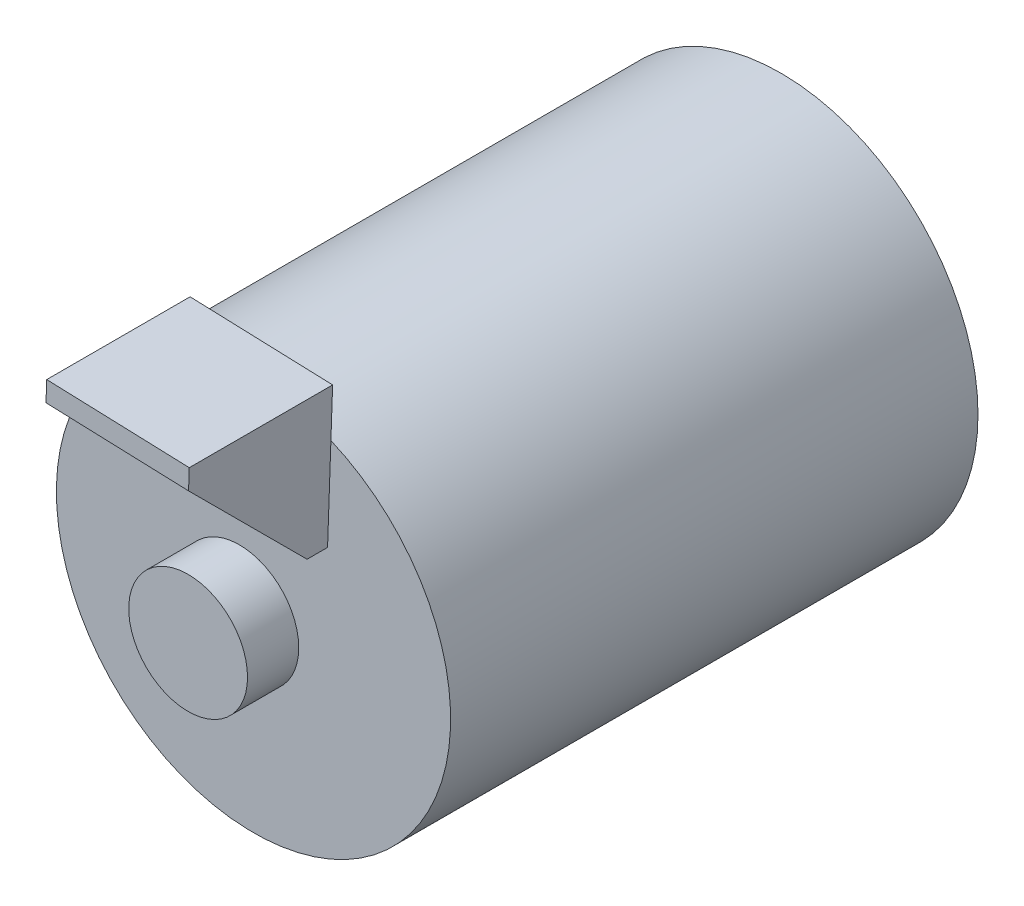
ISO-10303-21;
HEADER;
FILE_DESCRIPTION(('STEP AP214'),'2;1');
FILE_NAME('part.step','',(''),(''),'','','');
FILE_SCHEMA(('AUTOMOTIVE_DESIGN { 1 0 10303 214 1 1 1 1 }'));
ENDSEC;
DATA;
#1=APPLICATION_CONTEXT('core data for automotive mechanical design processes');
#2=APPLICATION_PROTOCOL_DEFINITION('international standard','automotive_design',2000,#1);
#3=PRODUCT_CONTEXT('',#1,'mechanical');
#4=PRODUCT('Part','Part','',(#3));
#5=PRODUCT_RELATED_PRODUCT_CATEGORY('part','',(#4));
#6=PRODUCT_DEFINITION_FORMATION('','',#4);
#7=PRODUCT_DEFINITION_CONTEXT('part definition',#1,'design');
#8=PRODUCT_DEFINITION('design','',#6,#7);
#9=PRODUCT_DEFINITION_SHAPE('','',#8);
#10=(LENGTH_UNIT() NAMED_UNIT(*) SI_UNIT(.MILLI.,.METRE.));
#11=(NAMED_UNIT(*) PLANE_ANGLE_UNIT() SI_UNIT($,.RADIAN.));
#12=(NAMED_UNIT(*) SI_UNIT($,.STERADIAN.) SOLID_ANGLE_UNIT());
#13=UNCERTAINTY_MEASURE_WITH_UNIT(LENGTH_MEASURE(1.E-05),#10,'distance_accuracy_value','');
#14=(GEOMETRIC_REPRESENTATION_CONTEXT(3) GLOBAL_UNCERTAINTY_ASSIGNED_CONTEXT((#13)) GLOBAL_UNIT_ASSIGNED_CONTEXT((#10,
#11,#12)) REPRESENTATION_CONTEXT('',''));
#15=CARTESIAN_POINT('',(0.,0.,0.));
#16=DIRECTION('',(0.,0.,1.));
#17=DIRECTION('',(1.,0.,0.));
#18=AXIS2_PLACEMENT_3D('',#15,#16,#17);
#19=CARTESIAN_POINT('',(14.6085511390068,16.9953003391827,107.));
#20=DIRECTION('',(-0.0249411804596424,-0.70666677968989,0.707106781186548));
#21=DIRECTION('',(0.,-0.707326816148419,-0.706886677733667));
#22=AXIS2_PLACEMENT_3D('',#19,#20,#21);
#23=PLANE('',#22);
#24=DIRECTION('',(-0.999377743915962,0.0352721556676211,0.));
#25=VECTOR('',#24,1.);
#26=CARTESIAN_POINT('',(0.758351346853853,21.4866214941932,111.));
#27=LINE('',#26,#25);
#28=CARTESIAN_POINT('',(10.6097199732771,21.1389261309077,111.));
#29=VERTEX_POINT('',#28);
#30=CARTESIAN_POINT('',(-9.23542609230577,21.8393430508694,111.));
#31=VERTEX_POINT('',#30);
#32=EDGE_CURVE('E146',#29,#31,#27,.T.);
#33=ORIENTED_EDGE('',*,*,#32,.T.);
#34=DIRECTION('',(0.0249411804596424,0.70666677968989,0.707106781186547));
#35=VECTOR('',#34,1.);
#36=CARTESIAN_POINT('',(-9.37651471497625,17.8418320752056,107.));
#37=LINE('',#36,#35);
#38=CARTESIAN_POINT('',(-8.52998297895335,41.8268979291887,131.));
#39=VERTEX_POINT('',#38);
#40=EDGE_CURVE('E219',#31,#39,#37,.T.);
#41=ORIENTED_EDGE('',*,*,#40,.T.);
#42=DIRECTION('',(0.999377743915963,-0.0352721556676211,0.));
#43=VECTOR('',#42,1.);
#44=CARTESIAN_POINT('',(1.46379446020627,41.4741763725125,131.));
#45=LINE('',#44,#43);
#46=CARTESIAN_POINT('',(-12.5274939546172,41.9679865518592,131.));
#47=VERTEX_POINT('',#46);
#48=EDGE_CURVE('E54',#47,#39,#45,.T.);
#49=ORIENTED_EDGE('',*,*,#48,.F.);
#50=DIRECTION('',(0.0249411804596424,0.70666677968989,0.707106781186547));
#51=VECTOR('',#50,1.);
#52=CARTESIAN_POINT('',(-13.3740256906401,17.982920697876,107.));
#53=LINE('',#52,#51);
#54=CARTESIAN_POINT('',(-13.3740256906401,17.982920697876,107.));
#55=VERTEX_POINT('',#54);
#56=EDGE_CURVE('E218',#55,#47,#53,.T.);
#57=ORIENTED_EDGE('',*,*,#56,.F.);
#58=DIRECTION('',(-0.999377743915962,0.0352721556676211,0.));
#59=VECTOR('',#58,1.);
#60=CARTESIAN_POINT('',(14.6085511390068,16.9953003391827,107.));
#61=LINE('',#60,#59);
#62=CARTESIAN_POINT('',(14.4661423262705,17.0003265325734,107.));
#63=VERTEX_POINT('',#62);
#64=EDGE_CURVE('E232',#63,#55,#61,.T.);
#65=ORIENTED_EDGE('',*,*,#64,.F.);
#66=DIRECTION('',(-0.0249411804596425,-0.70666677968989,-0.707106781186547));
#67=VECTOR('',#66,1.);
#68=CARTESIAN_POINT('',(14.5807768321902,20.2483042003002,110.25));
#69=LINE('',#68,#67);
#70=CARTESIAN_POINT('',(15.3126740622934,40.9853923865565,131.));
#71=VERTEX_POINT('',#70);
#72=EDGE_CURVE('E236',#71,#63,#69,.T.);
#73=ORIENTED_EDGE('',*,*,#72,.F.);
#74=CARTESIAN_POINT('',(11.3151630866295,41.1264810092269,131.));
#75=VERTEX_POINT('',#74);
#76=EDGE_CURVE('E69',#75,#71,#45,.T.);
#77=ORIENTED_EDGE('',*,*,#76,.F.);
#78=DIRECTION('',(-0.0249411804596425,-0.70666677968989,-0.707106781186547));
#79=VECTOR('',#78,1.);
#80=CARTESIAN_POINT('',(10.5832658565264,20.3893928229707,110.25));
#81=LINE('',#80,#79);
#82=EDGE_CURVE('E226',#75,#29,#81,.T.);
#83=ORIENTED_EDGE('',*,*,#82,.T.);
#84=EDGE_LOOP('',(#33,#41,#49,#57,#65,#73,#77,#83));
#85=FACE_BOUND('',#84,.T.);
#86=ADVANCED_FACE('F45',(#85),#23,.T.);
#87=CARTESIAN_POINT('',(13.8488796020871,-0.488783985956003,131.));
#88=DIRECTION('',(0.999377743915962,-0.0352721556676213,0.));
#89=DIRECTION('',(0.0352721556676213,0.999377743915963,0.));
#90=AXIS2_PLACEMENT_3D('',#87,#88,#89);
#91=PLANE('',#90);
#92=DIRECTION('',(-0.0352721556676213,-0.999377743915963,0.));
#93=VECTOR('',#92,1.);
#94=CARTESIAN_POINT('',(13.8488796020871,-0.488783985956003,131.));
#95=LINE('',#94,#93);
#96=CARTESIAN_POINT('',(15.4537626849639,44.9829033622203,131.));
#97=VERTEX_POINT('',#96);
#98=EDGE_CURVE('E241',#97,#71,#95,.T.);
#99=ORIENTED_EDGE('',*,*,#98,.T.);
#100=ORIENTED_EDGE('',*,*,#72,.T.);
#101=DIRECTION('',(0.,0.,-1.));
#102=VECTOR('',#101,1.);
#103=CARTESIAN_POINT('',(14.4661423262705,17.0003265325733,131.));
#104=LINE('',#103,#102);
#105=CARTESIAN_POINT('',(14.4661423262705,17.0003265325733,103.));
#106=VERTEX_POINT('',#105);
#107=EDGE_CURVE('E253',#63,#106,#104,.T.);
#108=ORIENTED_EDGE('',*,*,#107,.T.);
#109=DIRECTION('',(0.0352721556676213,0.999377743915963,0.));
#110=VECTOR('',#109,1.);
#111=CARTESIAN_POINT('',(13.8488796020871,-0.488783985956003,103.));
#112=LINE('',#111,#110);
#113=CARTESIAN_POINT('',(15.1158422870537,35.4084920880983,103.));
#114=VERTEX_POINT('',#113);
#115=EDGE_CURVE('E307',#106,#114,#112,.T.);
#116=ORIENTED_EDGE('',*,*,#115,.T.);
#117=DIRECTION('',(-0.0352721556676213,-0.999377743915963,0.));
#118=VECTOR('',#117,1.);
#119=CARTESIAN_POINT('',(13.8488796020871,-0.488783985956003,103.));
#120=LINE('',#119,#118);
#121=CARTESIAN_POINT('',(15.4537626849639,44.9829033622203,103.));
#122=VERTEX_POINT('',#121);
#123=EDGE_CURVE('E240',#122,#114,#120,.T.);
#124=ORIENTED_EDGE('',*,*,#123,.F.);
#125=DIRECTION('',(0.,0.,-1.));
#126=VECTOR('',#125,1.);
#127=CARTESIAN_POINT('',(15.4537626849639,44.9829033622203,131.));
#128=LINE('',#127,#126);
#129=EDGE_CURVE('E276',#97,#122,#128,.T.);
#130=ORIENTED_EDGE('',*,*,#129,.F.);
#131=EDGE_LOOP('',(#99,#100,#108,#116,#124,#130));
#132=FACE_BOUND('',#131,.T.);
#133=ADVANCED_FACE('F363',(#132),#91,.T.);
#134=CARTESIAN_POINT('',(-13.9912884148235,0.493810179346694,131.));
#135=DIRECTION('',(0.999377743915962,-0.035272155667621,0.));
#136=DIRECTION('',(0.035272155667621,0.999377743915963,0.));
#137=AXIS2_PLACEMENT_3D('',#134,#135,#136);
#138=PLANE('',#137);
#139=ORIENTED_EDGE('',*,*,#56,.T.);
#140=DIRECTION('',(-0.035272155667621,-0.999377743915963,0.));
#141=VECTOR('',#140,1.);
#142=CARTESIAN_POINT('',(-13.9912884148235,0.493810179346694,131.));
#143=LINE('',#142,#141);
#144=CARTESIAN_POINT('',(-12.3864053319467,45.965497527523,131.));
#145=VERTEX_POINT('',#144);
#146=EDGE_CURVE('E249',#145,#47,#143,.T.);
#147=ORIENTED_EDGE('',*,*,#146,.F.);
#148=DIRECTION('',(0.,0.,-1.));
#149=VECTOR('',#148,1.);
#150=CARTESIAN_POINT('',(-12.3864053319467,45.965497527523,131.));
#151=LINE('',#150,#149);
#152=CARTESIAN_POINT('',(-12.3864053319467,45.965497527523,103.));
#153=VERTEX_POINT('',#152);
#154=EDGE_CURVE('E272',#145,#153,#151,.T.);
#155=ORIENTED_EDGE('',*,*,#154,.T.);
#156=DIRECTION('',(-0.035272155667621,-0.999377743915963,0.));
#157=VECTOR('',#156,1.);
#158=CARTESIAN_POINT('',(-13.9912884148235,0.493810179346694,103.));
#159=LINE('',#158,#157);
#160=CARTESIAN_POINT('',(-12.7262762659497,36.335821064106,103.));
#161=VERTEX_POINT('',#160);
#162=EDGE_CURVE('E260',#153,#161,#159,.T.);
#163=ORIENTED_EDGE('',*,*,#162,.T.);
#164=DIRECTION('',(0.035272155667621,0.999377743915963,0.));
#165=VECTOR('',#164,1.);
#166=CARTESIAN_POINT('',(-13.9912884148235,0.493810179346695,103.));
#167=LINE('',#166,#165);
#168=CARTESIAN_POINT('',(-13.3740256906401,17.982920697876,103.));
#169=VERTEX_POINT('',#168);
#170=EDGE_CURVE('E296',#169,#161,#167,.T.);
#171=ORIENTED_EDGE('',*,*,#170,.F.);
#172=DIRECTION('',(0.,0.,-1.));
#173=VECTOR('',#172,1.);
#174=CARTESIAN_POINT('',(-13.3740256906401,17.982920697876,131.));
#175=LINE('',#174,#173);
#176=EDGE_CURVE('E269',#55,#169,#175,.T.);
#177=ORIENTED_EDGE('',*,*,#176,.F.);
#178=EDGE_LOOP('',(#139,#147,#155,#163,#171,#177));
#179=FACE_BOUND('',#178,.T.);
#180=ADVANCED_FACE('F369',(#179),#138,.F.);
#181=CARTESIAN_POINT('',(0.617262724183369,17.4891105185294,131.));
#182=DIRECTION('',(-0.0352721556676211,-0.999377743915962,0.));
#183=DIRECTION('',(0.999377743915963,-0.0352721556676211,0.));
#184=AXIS2_PLACEMENT_3D('',#181,#182,#183);
#185=PLANE('',#184);
#186=ORIENTED_EDGE('',*,*,#107,.F.);
#187=ORIENTED_EDGE('',*,*,#64,.T.);
#188=ORIENTED_EDGE('',*,*,#176,.T.);
#189=DIRECTION('',(-0.999377743915963,0.0352721556676211,0.));
#190=VECTOR('',#189,1.);
#191=CARTESIAN_POINT('',(0.617262724183369,17.4891105185294,103.));
#192=LINE('',#191,#190);
#193=EDGE_CURVE('E246',#106,#169,#192,.T.);
#194=ORIENTED_EDGE('',*,*,#193,.F.);
#195=EDGE_LOOP('',(#186,#187,#188,#194));
#196=FACE_BOUND('',#195,.T.);
#197=ADVANCED_FACE('F359',(#196),#185,.T.);
#198=CARTESIAN_POINT('',(0.,0.,131.));
#199=DIRECTION('',(0.,0.,1.));
#200=DIRECTION('',(1.,0.,0.));
#201=AXIS2_PLACEMENT_3D('',#198,#199,#200);
#202=PLANE('',#201);
#203=ORIENTED_EDGE('',*,*,#146,.T.);
#204=ORIENTED_EDGE('',*,*,#48,.T.);
#205=DIRECTION('',(0.999377743915963,-0.0352721556676211,0.));
#206=VECTOR('',#205,1.);
#207=CARTESIAN_POINT('',(1.46379446020627,41.4741763725125,131.));
#208=LINE('',#207,#206);
#209=EDGE_CURVE('E160',#39,#75,#208,.T.);
#210=ORIENTED_EDGE('',*,*,#209,.T.);
#211=ORIENTED_EDGE('',*,*,#76,.T.);
#212=ORIENTED_EDGE('',*,*,#98,.F.);
#213=DIRECTION('',(-0.999377743915963,0.0352721556676212,0.));
#214=VECTOR('',#213,1.);
#215=CARTESIAN_POINT('',(1.60488308287676,45.4716873481763,131.));
#216=LINE('',#215,#214);
#217=EDGE_CURVE('E245',#97,#145,#216,.T.);
#218=ORIENTED_EDGE('',*,*,#217,.T.);
#219=EDGE_LOOP('',(#203,#204,#210,#211,#212,#218));
#220=FACE_BOUND('',#219,.T.);
#221=ADVANCED_FACE('F350',(#220),#202,.T.);
#222=CARTESIAN_POINT('',(0.,0.,103.));
#223=DIRECTION('',(0.,0.,-1.));
#224=DIRECTION('',(-1.,0.,0.));
#225=AXIS2_PLACEMENT_3D('',#222,#223,#224);
#226=CYLINDRICAL_SURFACE('',#225,38.5);
#227=CARTESIAN_POINT('',(0.,0.,103.));
#228=DIRECTION('',(0.,0.,1.));
#229=DIRECTION('',(1.,0.,0.));
#230=AXIS2_PLACEMENT_3D('',#227,#228,#229);
#231=CIRCLE('',#230,38.5);
#232=EDGE_CURVE('E297',#114,#161,#231,.T.);
#233=ORIENTED_EDGE('',*,*,#232,.F.);
#234=EDGE_CURVE('E301',#161,#114,#231,.T.);
#235=ORIENTED_EDGE('',*,*,#234,.F.);
#236=EDGE_LOOP('',(#233,#235));
#237=FACE_BOUND('',#236,.T.);
#238=CARTESIAN_POINT('',(0.,0.,0.));
#239=DIRECTION('',(0.,0.,1.));
#240=DIRECTION('',(1.,0.,0.));
#241=AXIS2_PLACEMENT_3D('',#238,#239,#240);
#242=CIRCLE('',#241,38.5);
#243=CARTESIAN_POINT('',(38.5,0.,0.));
#244=VERTEX_POINT('',#243);
#245=EDGE_CURVE('E291',#244,#244,#242,.T.);
#246=ORIENTED_EDGE('',*,*,#245,.T.);
#247=EDGE_LOOP('',(#246));
#248=FACE_BOUND('',#247,.T.);
#249=ADVANCED_FACE('F47',(#237,#248),#226,.T.);
#250=CARTESIAN_POINT('',(0.,0.,103.));
#251=DIRECTION('',(0.,0.,1.));
#252=DIRECTION('',(1.,0.,0.));
#253=AXIS2_PLACEMENT_3D('',#250,#251,#252);
#254=PLANE('',#253);
#255=ORIENTED_EDGE('',*,*,#115,.F.);
#256=ORIENTED_EDGE('',*,*,#193,.T.);
#257=ORIENTED_EDGE('',*,*,#170,.T.);
#258=ORIENTED_EDGE('',*,*,#234,.T.);
#259=EDGE_LOOP('',(#255,#256,#257,#258));
#260=FACE_BOUND('',#259,.T.);
#261=CARTESIAN_POINT('',(0.,0.,103.));
#262=DIRECTION('',(0.,0.,1.));
#263=DIRECTION('',(1.,0.,0.));
#264=AXIS2_PLACEMENT_3D('',#261,#262,#263);
#265=CIRCLE('',#264,6.);
#266=CARTESIAN_POINT('',(6.,0.,103.));
#267=VERTEX_POINT('',#266);
#268=EDGE_CURVE('E292',#267,#267,#265,.T.);
#269=ORIENTED_EDGE('',*,*,#268,.F.);
#270=EDGE_LOOP('',(#269));
#271=FACE_BOUND('',#270,.T.);
#272=ADVANCED_FACE('F346',(#260,#271),#254,.T.);
#273=CARTESIAN_POINT('',(0.,0.,0.));
#274=DIRECTION('',(0.,0.,1.));
#275=DIRECTION('',(1.,0.,0.));
#276=AXIS2_PLACEMENT_3D('',#273,#274,#275);
#277=PLANE('',#276);
#278=CARTESIAN_POINT('',(0.,0.,0.));
#279=DIRECTION('',(0.,0.,1.));
#280=DIRECTION('',(1.,0.,0.));
#281=AXIS2_PLACEMENT_3D('',#278,#279,#280);
#282=CIRCLE('',#281,5.);
#283=CARTESIAN_POINT('',(5.,0.,0.));
#284=VERTEX_POINT('',#283);
#285=EDGE_CURVE('E11',#284,#284,#282,.F.);
#286=ORIENTED_EDGE('',*,*,#285,.F.);
#287=EDGE_LOOP('',(#286));
#288=FACE_BOUND('',#287,.T.);
#289=ORIENTED_EDGE('',*,*,#245,.F.);
#290=EDGE_LOOP('',(#289));
#291=FACE_BOUND('',#290,.T.);
#292=ADVANCED_FACE('F342',(#288,#291),#277,.F.);
#293=CARTESIAN_POINT('',(0.,0.,115.76716629368));
#294=DIRECTION('',(0.,0.,1.));
#295=DIRECTION('',(1.,0.,0.));
#296=AXIS2_PLACEMENT_3D('',#293,#294,#295);
#297=CYLINDRICAL_SURFACE('',#296,6.);
#298=ORIENTED_EDGE('',*,*,#268,.T.);
#299=EDGE_LOOP('',(#298));
#300=FACE_BOUND('',#299,.T.);
#301=CARTESIAN_POINT('',(0.,0.,105.76716629368));
#302=DIRECTION('',(0.,0.,1.));
#303=DIRECTION('',(1.,0.,0.));
#304=AXIS2_PLACEMENT_3D('',#301,#302,#303);
#305=CIRCLE('',#304,6.);
#306=CARTESIAN_POINT('',(6.,0.,105.76716629368));
#307=VERTEX_POINT('',#306);
#308=EDGE_CURVE('E287',#307,#307,#305,.T.);
#309=ORIENTED_EDGE('',*,*,#308,.F.);
#310=EDGE_LOOP('',(#309));
#311=FACE_BOUND('',#310,.T.);
#312=ADVANCED_FACE('F345',(#300,#311),#297,.T.);
#313=CARTESIAN_POINT('',(0.,-6.,105.76716629368));
#314=DIRECTION('',(0.,0.,-1.));
#315=DIRECTION('',(-1.,0.,0.));
#316=AXIS2_PLACEMENT_3D('',#313,#314,#315);
#317=PLANE('',#316);
#318=ORIENTED_EDGE('',*,*,#308,.T.);
#319=EDGE_LOOP('',(#318));
#320=FACE_BOUND('',#319,.T.);
#321=CARTESIAN_POINT('',(0.,0.,105.76716629368));
#322=DIRECTION('',(0.,0.,1.));
#323=DIRECTION('',(1.,0.,0.));
#324=AXIS2_PLACEMENT_3D('',#321,#322,#323);
#325=CIRCLE('',#324,11.6);
#326=CARTESIAN_POINT('',(11.6,0.,105.76716629368));
#327=VERTEX_POINT('',#326);
#328=EDGE_CURVE('E283',#327,#327,#325,.T.);
#329=ORIENTED_EDGE('',*,*,#328,.F.);
#330=EDGE_LOOP('',(#329));
#331=FACE_BOUND('',#330,.T.);
#332=ADVANCED_FACE('F396',(#320,#331),#317,.T.);
#333=CARTESIAN_POINT('',(0.,0.,115.76716629368));
#334=DIRECTION('',(0.,0.,1.));
#335=DIRECTION('',(1.,0.,0.));
#336=AXIS2_PLACEMENT_3D('',#333,#334,#335);
#337=CYLINDRICAL_SURFACE('',#336,11.6);
#338=ORIENTED_EDGE('',*,*,#328,.T.);
#339=EDGE_LOOP('',(#338));
#340=FACE_BOUND('',#339,.T.);
#341=CARTESIAN_POINT('',(0.,0.,115.76716629368));
#342=DIRECTION('',(0.,0.,1.));
#343=DIRECTION('',(1.,0.,0.));
#344=AXIS2_PLACEMENT_3D('',#341,#342,#343);
#345=CIRCLE('',#344,11.6);
#346=CARTESIAN_POINT('',(11.6,0.,115.76716629368));
#347=VERTEX_POINT('',#346);
#348=EDGE_CURVE('E279',#347,#347,#345,.T.);
#349=ORIENTED_EDGE('',*,*,#348,.F.);
#350=EDGE_LOOP('',(#349));
#351=FACE_BOUND('',#350,.T.);
#352=ADVANCED_FACE('F392',(#340,#351),#337,.T.);
#353=CARTESIAN_POINT('',(0.,-11.6,115.76716629368));
#354=DIRECTION('',(0.,0.,1.));
#355=DIRECTION('',(1.,0.,0.));
#356=AXIS2_PLACEMENT_3D('',#353,#354,#355);
#357=PLANE('',#356);
#358=ORIENTED_EDGE('',*,*,#348,.T.);
#359=EDGE_LOOP('',(#358));
#360=FACE_BOUND('',#359,.T.);
#361=ADVANCED_FACE('F387',(#360),#357,.T.);
#362=CARTESIAN_POINT('',(1.60488308287676,45.4716873481763,131.));
#363=DIRECTION('',(-0.0352721556676212,-0.999377743915962,0.));
#364=DIRECTION('',(0.999377743915963,-0.0352721556676212,0.));
#365=AXIS2_PLACEMENT_3D('',#362,#363,#364);
#366=PLANE('',#365);
#367=DIRECTION('',(-0.999377743915963,0.0352721556676212,0.));
#368=VECTOR('',#367,1.);
#369=CARTESIAN_POINT('',(1.60488308287676,45.4716873481763,103.));
#370=LINE('',#369,#368);
#371=EDGE_CURVE('E257',#122,#153,#370,.T.);
#372=ORIENTED_EDGE('',*,*,#371,.T.);
#373=ORIENTED_EDGE('',*,*,#154,.F.);
#374=ORIENTED_EDGE('',*,*,#217,.F.);
#375=ORIENTED_EDGE('',*,*,#129,.T.);
#376=EDGE_LOOP('',(#372,#373,#374,#375));
#377=FACE_BOUND('',#376,.T.);
#378=ADVANCED_FACE('F378',(#377),#366,.F.);
#379=CARTESIAN_POINT('',(0.,0.,103.));
#380=DIRECTION('',(0.,0.,1.));
#381=DIRECTION('',(1.,0.,0.));
#382=AXIS2_PLACEMENT_3D('',#379,#380,#381);
#383=PLANE('',#382);
#384=ORIENTED_EDGE('',*,*,#123,.T.);
#385=ORIENTED_EDGE('',*,*,#232,.T.);
#386=ORIENTED_EDGE('',*,*,#162,.F.);
#387=ORIENTED_EDGE('',*,*,#371,.F.);
#388=EDGE_LOOP('',(#384,#385,#386,#387));
#389=FACE_BOUND('',#388,.T.);
#390=ADVANCED_FACE('F375',(#389),#383,.F.);
#391=CARTESIAN_POINT('',(9.85136862642326,-0.347695363285518,131.));
#392=DIRECTION('',(0.999377743915962,-0.0352721556676213,0.));
#393=DIRECTION('',(0.0352721556676213,0.999377743915963,0.));
#394=AXIS2_PLACEMENT_3D('',#391,#392,#393);
#395=PLANE('',#394);
#396=DIRECTION('',(0.,0.,-1.));
#397=VECTOR('',#396,1.);
#398=CARTESIAN_POINT('',(11.3151630866295,41.1264810092269,131.));
#399=LINE('',#398,#397);
#400=CARTESIAN_POINT('',(11.3151630866295,41.1264810092269,107.));
#401=VERTEX_POINT('',#400);
#402=EDGE_CURVE('E61',#75,#401,#399,.T.);
#403=ORIENTED_EDGE('',*,*,#402,.T.);
#404=DIRECTION('',(-0.0352721556676213,-0.999377743915963,0.));
#405=VECTOR('',#404,1.);
#406=CARTESIAN_POINT('',(9.85136862642326,-0.347695363285518,107.));
#407=LINE('',#406,#405);
#408=CARTESIAN_POINT('',(11.0175279956631,32.6934867651767,107.));
#409=VERTEX_POINT('',#408);
#410=EDGE_CURVE('E211',#401,#409,#407,.T.);
#411=ORIENTED_EDGE('',*,*,#410,.T.);
#412=DIRECTION('',(0.,0.,-1.));
#413=VECTOR('',#412,1.);
#414=CARTESIAN_POINT('',(11.0175279956631,32.6934867651767,107.));
#415=LINE('',#414,#413);
#416=CARTESIAN_POINT('',(11.0175279956631,32.6934867651767,99.));
#417=VERTEX_POINT('',#416);
#418=EDGE_CURVE('E156',#409,#417,#415,.T.);
#419=ORIENTED_EDGE('',*,*,#418,.T.);
#420=DIRECTION('',(0.0352721556676213,0.999377743915963,0.));
#421=VECTOR('',#420,1.);
#422=CARTESIAN_POINT('',(9.85136862642326,-0.347695363285518,99.));
#423=LINE('',#422,#421);
#424=CARTESIAN_POINT('',(10.6097199732771,21.1389261309077,99.));
#425=VERTEX_POINT('',#424);
#426=EDGE_CURVE('E153',#425,#417,#423,.T.);
#427=ORIENTED_EDGE('',*,*,#426,.F.);
#428=DIRECTION('',(0.,0.,-1.));
#429=VECTOR('',#428,1.);
#430=CARTESIAN_POINT('',(10.6097199732771,21.1389261309077,131.));
#431=LINE('',#430,#429);
#432=EDGE_CURVE('E138',#29,#425,#431,.T.);
#433=ORIENTED_EDGE('',*,*,#432,.F.);
#434=ORIENTED_EDGE('',*,*,#82,.F.);
#435=EDGE_LOOP('',(#403,#411,#419,#427,#433,#434));
#436=FACE_BOUND('',#435,.T.);
#437=ADVANCED_FACE('F154',(#436),#395,.F.);
#438=CARTESIAN_POINT('',(-9.99377743915962,0.35272155667621,131.));
#439=DIRECTION('',(0.999377743915962,-0.035272155667621,0.));
#440=DIRECTION('',(0.035272155667621,0.999377743915963,0.));
#441=AXIS2_PLACEMENT_3D('',#438,#439,#440);
#442=PLANE('',#441);
#443=ORIENTED_EDGE('',*,*,#40,.F.);
#444=DIRECTION('',(0.,0.,-1.));
#445=VECTOR('',#444,1.);
#446=CARTESIAN_POINT('',(-9.23542609230577,21.8393430508694,131.));
#447=LINE('',#446,#445);
#448=CARTESIAN_POINT('',(-9.23542609230577,21.8393430508694,99.));
#449=VERTEX_POINT('',#448);
#450=EDGE_CURVE('E150',#31,#449,#447,.T.);
#451=ORIENTED_EDGE('',*,*,#450,.T.);
#452=DIRECTION('',(0.035272155667621,0.999377743915963,0.));
#453=VECTOR('',#452,1.);
#454=CARTESIAN_POINT('',(-9.99377743915963,0.35272155667621,99.));
#455=LINE('',#454,#453);
#456=CARTESIAN_POINT('',(-8.82912846046607,33.3511092863279,99.));
#457=VERTEX_POINT('',#456);
#458=EDGE_CURVE('E161',#449,#457,#455,.T.);
#459=ORIENTED_EDGE('',*,*,#458,.T.);
#460=DIRECTION('',(0.,0.,-1.));
#461=VECTOR('',#460,1.);
#462=CARTESIAN_POINT('',(-8.82912846046607,33.3511092863279,107.));
#463=LINE('',#462,#461);
#464=CARTESIAN_POINT('',(-8.82912846046607,33.3511092863279,107.));
#465=VERTEX_POINT('',#464);
#466=EDGE_CURVE('E214',#465,#457,#463,.T.);
#467=ORIENTED_EDGE('',*,*,#466,.F.);
#468=DIRECTION('',(-0.035272155667621,-0.999377743915963,0.));
#469=VECTOR('',#468,1.);
#470=CARTESIAN_POINT('',(-9.99377743915962,0.35272155667621,107.));
#471=LINE('',#470,#469);
#472=CARTESIAN_POINT('',(-8.52998297895335,41.8268979291887,107.));
#473=VERTEX_POINT('',#472);
#474=EDGE_CURVE('E167',#473,#465,#471,.T.);
#475=ORIENTED_EDGE('',*,*,#474,.F.);
#476=DIRECTION('',(0.,0.,-1.));
#477=VECTOR('',#476,1.);
#478=CARTESIAN_POINT('',(-8.52998297895335,41.8268979291887,131.));
#479=LINE('',#478,#477);
#480=EDGE_CURVE('E176',#39,#473,#479,.T.);
#481=ORIENTED_EDGE('',*,*,#480,.F.);
#482=EDGE_LOOP('',(#443,#451,#459,#467,#475,#481));
#483=FACE_BOUND('',#482,.T.);
#484=ADVANCED_FACE('F319',(#483),#442,.T.);
#485=CARTESIAN_POINT('',(0.758351346853853,21.4866214941932,131.));
#486=DIRECTION('',(-0.0352721556676211,-0.999377743915962,0.));
#487=DIRECTION('',(0.999377743915963,-0.0352721556676211,0.));
#488=AXIS2_PLACEMENT_3D('',#485,#486,#487);
#489=PLANE('',#488);
#490=ORIENTED_EDGE('',*,*,#432,.T.);
#491=DIRECTION('',(-0.999377743915963,0.0352721556676211,0.));
#492=VECTOR('',#491,1.);
#493=CARTESIAN_POINT('',(0.758351346853853,21.4866214941932,99.));
#494=LINE('',#493,#492);
#495=EDGE_CURVE('E143',#425,#449,#494,.T.);
#496=ORIENTED_EDGE('',*,*,#495,.T.);
#497=ORIENTED_EDGE('',*,*,#450,.F.);
#498=ORIENTED_EDGE('',*,*,#32,.F.);
#499=EDGE_LOOP('',(#490,#496,#497,#498));
#500=FACE_BOUND('',#499,.T.);
#501=ADVANCED_FACE('F140',(#500),#489,.F.);
#502=CARTESIAN_POINT('',(0.,0.,103.));
#503=DIRECTION('',(0.,0.,-1.));
#504=DIRECTION('',(-1.,0.,0.));
#505=AXIS2_PLACEMENT_3D('',#502,#503,#504);
#506=CYLINDRICAL_SURFACE('',#505,34.5);
#507=CARTESIAN_POINT('',(0.,0.,107.));
#508=DIRECTION('',(0.,0.,1.));
#509=DIRECTION('',(1.,0.,0.));
#510=AXIS2_PLACEMENT_3D('',#507,#508,#509);
#511=CIRCLE('',#510,34.5);
#512=EDGE_CURVE('E183',#409,#465,#511,.T.);
#513=ORIENTED_EDGE('',*,*,#512,.T.);
#514=ORIENTED_EDGE('',*,*,#466,.T.);
#515=CARTESIAN_POINT('',(0.,0.,99.));
#516=DIRECTION('',(0.,0.,1.));
#517=DIRECTION('',(1.,0.,0.));
#518=AXIS2_PLACEMENT_3D('',#515,#516,#517);
#519=CIRCLE('',#518,34.5);
#520=EDGE_CURVE('E187',#457,#417,#519,.T.);
#521=ORIENTED_EDGE('',*,*,#520,.T.);
#522=ORIENTED_EDGE('',*,*,#418,.F.);
#523=EDGE_LOOP('',(#513,#514,#521,#522));
#524=FACE_BOUND('',#523,.T.);
#525=CARTESIAN_POINT('',(0.,0.,4.));
#526=DIRECTION('',(0.,0.,1.));
#527=DIRECTION('',(1.,0.,0.));
#528=AXIS2_PLACEMENT_3D('',#525,#526,#527);
#529=CIRCLE('',#528,34.5);
#530=CARTESIAN_POINT('',(34.5,0.,4.));
#531=VERTEX_POINT('',#530);
#532=EDGE_CURVE('E190',#531,#531,#529,.T.);
#533=ORIENTED_EDGE('',*,*,#532,.F.);
#534=EDGE_LOOP('',(#533));
#535=FACE_BOUND('',#534,.T.);
#536=ADVANCED_FACE('F431',(#524,#535),#506,.F.);
#537=CARTESIAN_POINT('',(0.,0.,99.));
#538=DIRECTION('',(0.,0.,1.));
#539=DIRECTION('',(1.,0.,0.));
#540=AXIS2_PLACEMENT_3D('',#537,#538,#539);
#541=PLANE('',#540);
#542=ORIENTED_EDGE('',*,*,#426,.T.);
#543=ORIENTED_EDGE('',*,*,#520,.F.);
#544=ORIENTED_EDGE('',*,*,#458,.F.);
#545=ORIENTED_EDGE('',*,*,#495,.F.);
#546=EDGE_LOOP('',(#542,#543,#544,#545));
#547=FACE_BOUND('',#546,.T.);
#548=CARTESIAN_POINT('',(0.,0.,99.));
#549=DIRECTION('',(0.,0.,1.));
#550=DIRECTION('',(1.,0.,0.));
#551=AXIS2_PLACEMENT_3D('',#548,#549,#550);
#552=CIRCLE('',#551,2.);
#553=CARTESIAN_POINT('',(2.,0.,99.));
#554=VERTEX_POINT('',#553);
#555=EDGE_CURVE('E182',#554,#554,#552,.T.);
#556=ORIENTED_EDGE('',*,*,#555,.T.);
#557=EDGE_LOOP('',(#556));
#558=FACE_BOUND('',#557,.T.);
#559=ADVANCED_FACE('F163',(#547,#558),#541,.F.);
#560=CARTESIAN_POINT('',(0.,0.,4.));
#561=DIRECTION('',(0.,0.,1.));
#562=DIRECTION('',(1.,0.,0.));
#563=AXIS2_PLACEMENT_3D('',#560,#561,#562);
#564=PLANE('',#563);
#565=ORIENTED_EDGE('',*,*,#532,.T.);
#566=EDGE_LOOP('',(#565));
#567=FACE_BOUND('',#566,.T.);
#568=ADVANCED_FACE('F445',(#567),#564,.T.);
#569=CARTESIAN_POINT('',(0.,0.,115.76716629368));
#570=DIRECTION('',(0.,0.,1.));
#571=DIRECTION('',(1.,0.,0.));
#572=AXIS2_PLACEMENT_3D('',#569,#570,#571);
#573=CYLINDRICAL_SURFACE('',#572,2.);
#574=ORIENTED_EDGE('',*,*,#555,.F.);
#575=EDGE_LOOP('',(#574));
#576=FACE_BOUND('',#575,.T.);
#577=CARTESIAN_POINT('',(0.,0.,109.76716629368));
#578=DIRECTION('',(0.,0.,-1.));
#579=DIRECTION('',(-1.,0.,0.));
#580=AXIS2_PLACEMENT_3D('',#577,#578,#579);
#581=CIRCLE('',#580,2.);
#582=CARTESIAN_POINT('',(-2.,0.,109.76716629368));
#583=VERTEX_POINT('',#582);
#584=EDGE_CURVE('E194',#583,#583,#581,.F.);
#585=ORIENTED_EDGE('',*,*,#584,.T.);
#586=EDGE_LOOP('',(#585));
#587=FACE_BOUND('',#586,.T.);
#588=ADVANCED_FACE('F453',(#576,#587),#573,.F.);
#589=CARTESIAN_POINT('',(0.,-6.,109.76716629368));
#590=DIRECTION('',(0.,0.,-1.));
#591=DIRECTION('',(-1.,0.,0.));
#592=AXIS2_PLACEMENT_3D('',#589,#590,#591);
#593=PLANE('',#592);
#594=ORIENTED_EDGE('',*,*,#584,.F.);
#595=EDGE_LOOP('',(#594));
#596=FACE_BOUND('',#595,.T.);
#597=CARTESIAN_POINT('',(0.,0.,109.76716629368));
#598=DIRECTION('',(0.,0.,-1.));
#599=DIRECTION('',(-1.,0.,0.));
#600=AXIS2_PLACEMENT_3D('',#597,#598,#599);
#601=CIRCLE('',#600,7.6);
#602=CARTESIAN_POINT('',(-7.6,0.,109.76716629368));
#603=VERTEX_POINT('',#602);
#604=EDGE_CURVE('E201',#603,#603,#601,.F.);
#605=ORIENTED_EDGE('',*,*,#604,.T.);
#606=EDGE_LOOP('',(#605));
#607=FACE_BOUND('',#606,.T.);
#608=ADVANCED_FACE('F462',(#596,#607),#593,.F.);
#609=CARTESIAN_POINT('',(0.,0.,115.76716629368));
#610=DIRECTION('',(0.,0.,1.));
#611=DIRECTION('',(1.,0.,0.));
#612=AXIS2_PLACEMENT_3D('',#609,#610,#611);
#613=CYLINDRICAL_SURFACE('',#612,7.6);
#614=ORIENTED_EDGE('',*,*,#604,.F.);
#615=EDGE_LOOP('',(#614));
#616=FACE_BOUND('',#615,.T.);
#617=CARTESIAN_POINT('',(0.,0.,111.76716629368));
#618=DIRECTION('',(0.,0.,1.));
#619=DIRECTION('',(1.,0.,0.));
#620=AXIS2_PLACEMENT_3D('',#617,#618,#619);
#621=CIRCLE('',#620,7.6);
#622=CARTESIAN_POINT('',(7.6,0.,111.76716629368));
#623=VERTEX_POINT('',#622);
#624=EDGE_CURVE('E205',#623,#623,#621,.T.);
#625=ORIENTED_EDGE('',*,*,#624,.T.);
#626=EDGE_LOOP('',(#625));
#627=FACE_BOUND('',#626,.T.);
#628=ADVANCED_FACE('F471',(#616,#627),#613,.F.);
#629=CARTESIAN_POINT('',(0.,-11.6,111.76716629368));
#630=DIRECTION('',(0.,0.,1.));
#631=DIRECTION('',(1.,0.,0.));
#632=AXIS2_PLACEMENT_3D('',#629,#630,#631);
#633=PLANE('',#632);
#634=ORIENTED_EDGE('',*,*,#624,.F.);
#635=EDGE_LOOP('',(#634));
#636=FACE_BOUND('',#635,.T.);
#637=ADVANCED_FACE('F479',(#636),#633,.F.);
#638=CARTESIAN_POINT('',(1.46379446020628,41.4741763725125,131.));
#639=DIRECTION('',(-0.0352721556676212,-0.999377743915962,0.));
#640=DIRECTION('',(0.999377743915963,-0.0352721556676212,0.));
#641=AXIS2_PLACEMENT_3D('',#638,#639,#640);
#642=PLANE('',#641);
#643=DIRECTION('',(-0.999377743915963,0.0352721556676212,0.));
#644=VECTOR('',#643,1.);
#645=CARTESIAN_POINT('',(1.46379446020628,41.4741763725125,107.));
#646=LINE('',#645,#644);
#647=EDGE_CURVE('E171',#401,#473,#646,.T.);
#648=ORIENTED_EDGE('',*,*,#647,.F.);
#649=ORIENTED_EDGE('',*,*,#402,.F.);
#650=ORIENTED_EDGE('',*,*,#209,.F.);
#651=ORIENTED_EDGE('',*,*,#480,.T.);
#652=EDGE_LOOP('',(#648,#649,#650,#651));
#653=FACE_BOUND('',#652,.T.);
#654=ADVANCED_FACE('F322',(#653),#642,.T.);
#655=CARTESIAN_POINT('',(0.,0.,107.));
#656=DIRECTION('',(0.,0.,1.));
#657=DIRECTION('',(1.,0.,0.));
#658=AXIS2_PLACEMENT_3D('',#655,#656,#657);
#659=PLANE('',#658);
#660=ORIENTED_EDGE('',*,*,#410,.F.);
#661=ORIENTED_EDGE('',*,*,#647,.T.);
#662=ORIENTED_EDGE('',*,*,#474,.T.);
#663=ORIENTED_EDGE('',*,*,#512,.F.);
#664=EDGE_LOOP('',(#660,#661,#662,#663));
#665=FACE_BOUND('',#664,.T.);
#666=ADVANCED_FACE('F326',(#665),#659,.T.);
#667=CARTESIAN_POINT('',(0.,0.,-12.));
#668=DIRECTION('',(0.,0.,1.));
#669=DIRECTION('',(1.,0.,0.));
#670=AXIS2_PLACEMENT_3D('',#667,#668,#669);
#671=CYLINDRICAL_SURFACE('',#670,5.);
#672=CARTESIAN_POINT('',(0.,0.,-12.));
#673=DIRECTION('',(0.,0.,-1.));
#674=DIRECTION('',(-1.,0.,0.));
#675=AXIS2_PLACEMENT_3D('',#672,#673,#674);
#676=CIRCLE('',#675,5.);
#677=CARTESIAN_POINT('',(-5.,0.,-12.));
#678=VERTEX_POINT('',#677);
#679=EDGE_CURVE('E223',#678,#678,#676,.T.);
#680=ORIENTED_EDGE('',*,*,#679,.F.);
#681=EDGE_LOOP('',(#680));
#682=FACE_BOUND('',#681,.T.);
#683=ORIENTED_EDGE('',*,*,#285,.T.);
#684=EDGE_LOOP('',(#683));
#685=FACE_BOUND('',#684,.T.);
#686=ADVANCED_FACE('F336',(#682,#685),#671,.T.);
#687=CARTESIAN_POINT('',(0.,0.,-12.));
#688=DIRECTION('',(0.,0.,-1.));
#689=DIRECTION('',(-1.,0.,0.));
#690=AXIS2_PLACEMENT_3D('',#687,#688,#689);
#691=PLANE('',#690);
#692=ORIENTED_EDGE('',*,*,#679,.T.);
#693=EDGE_LOOP('',(#692));
#694=FACE_BOUND('',#693,.T.);
#695=ADVANCED_FACE('F334',(#694),#691,.T.);
#696=CLOSED_SHELL('',(#86,#133,#180,#197,#221,#249,#272,#292,#312,#332,#352,#361,#378,#390,#437,
#484,#501,#536,#559,#568,#588,#608,#628,#637,#654,#666,#686,#695));
#697=MANIFOLD_SOLID_BREP('B2',#696);
#698=ADVANCED_BREP_SHAPE_REPRESENTATION('',(#18,#697),#14);
#699=SHAPE_DEFINITION_REPRESENTATION(#9,#698);
ENDSEC;
END-ISO-10303-21;
